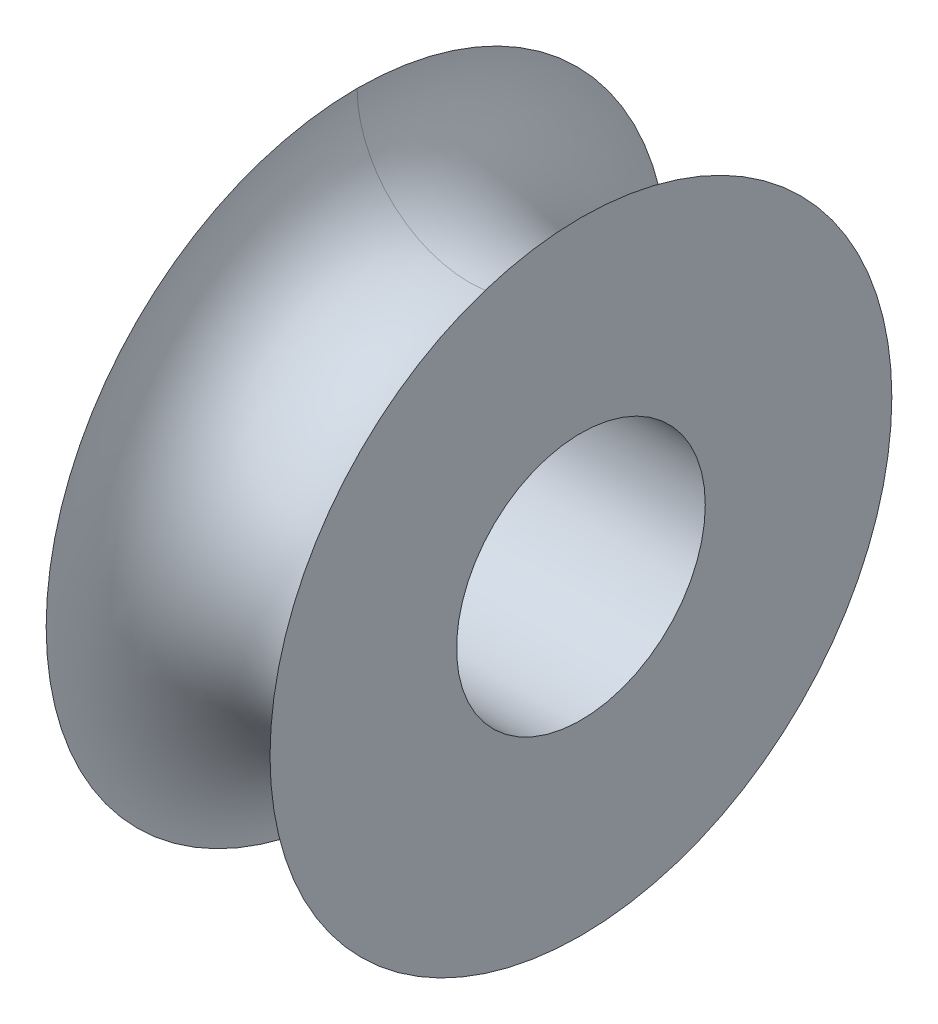
ISO-10303-21;
HEADER;
FILE_DESCRIPTION(('STEP AP214'),'2;1');
FILE_NAME('part.step','',(''),(''),'','','');
FILE_SCHEMA(('AUTOMOTIVE_DESIGN { 1 0 10303 214 1 1 1 1 }'));
ENDSEC;
DATA;
#1=APPLICATION_CONTEXT('core data for automotive mechanical design processes');
#2=APPLICATION_PROTOCOL_DEFINITION('international standard','automotive_design',2000,#1);
#3=PRODUCT_CONTEXT('',#1,'mechanical');
#4=PRODUCT('Part','Part','',(#3));
#5=PRODUCT_RELATED_PRODUCT_CATEGORY('part','',(#4));
#6=PRODUCT_DEFINITION_FORMATION('','',#4);
#7=PRODUCT_DEFINITION_CONTEXT('part definition',#1,'design');
#8=PRODUCT_DEFINITION('design','',#6,#7);
#9=PRODUCT_DEFINITION_SHAPE('','',#8);
#10=(LENGTH_UNIT() NAMED_UNIT(*) SI_UNIT(.MILLI.,.METRE.));
#11=(NAMED_UNIT(*) PLANE_ANGLE_UNIT() SI_UNIT($,.RADIAN.));
#12=(NAMED_UNIT(*) SI_UNIT($,.STERADIAN.) SOLID_ANGLE_UNIT());
#13=UNCERTAINTY_MEASURE_WITH_UNIT(LENGTH_MEASURE(1.E-05),#10,'distance_accuracy_value','');
#14=(GEOMETRIC_REPRESENTATION_CONTEXT(3) GLOBAL_UNCERTAINTY_ASSIGNED_CONTEXT((#13)) GLOBAL_UNIT_ASSIGNED_CONTEXT((#10,
#11,#12)) REPRESENTATION_CONTEXT('',''));
#15=CARTESIAN_POINT('',(0.,0.,0.));
#16=DIRECTION('',(0.,0.,1.));
#17=DIRECTION('',(1.,0.,0.));
#18=AXIS2_PLACEMENT_3D('',#15,#16,#17);
#19=CARTESIAN_POINT('',(1.8,0.,0.));
#20=DIRECTION('',(1.,0.,0.));
#21=DIRECTION('',(0.,0.,-1.));
#22=AXIS2_PLACEMENT_3D('',#19,#20,#21);
#23=PLANE('',#22);
#24=CARTESIAN_POINT('',(1.8,0.,0.));
#25=DIRECTION('',(1.,0.,0.));
#26=DIRECTION('',(0.,0.,-1.));
#27=AXIS2_PLACEMENT_3D('',#24,#25,#26);
#28=CIRCLE('',#27,2.5);
#29=CARTESIAN_POINT('',(1.8,0.,-2.5));
#30=VERTEX_POINT('',#29);
#31=CARTESIAN_POINT('',(1.8,2.5,0.));
#32=VERTEX_POINT('',#31);
#33=EDGE_CURVE('E11',#30,#32,#28,.T.);
#34=ORIENTED_EDGE('',*,*,#33,.T.);
#35=CARTESIAN_POINT('',(1.8,0.,0.));
#36=DIRECTION('',(-1.,0.,0.));
#37=DIRECTION('',(0.,0.,-1.));
#38=AXIS2_PLACEMENT_3D('',#35,#36,#37);
#39=CIRCLE('',#38,2.5);
#40=EDGE_CURVE('E74',#30,#32,#39,.T.);
#41=ORIENTED_EDGE('',*,*,#40,.F.);
#42=EDGE_LOOP('',(#34,#41));
#43=FACE_BOUND('',#42,.T.);
#44=CARTESIAN_POINT('',(1.8,0.,0.));
#45=DIRECTION('',(1.,0.,0.));
#46=DIRECTION('',(0.,0.,-1.));
#47=AXIS2_PLACEMENT_3D('',#44,#45,#46);
#48=CIRCLE('',#47,1.);
#49=CARTESIAN_POINT('',(1.8,0.,-1.));
#50=VERTEX_POINT('',#49);
#51=EDGE_CURVE('E85',#50,#50,#48,.T.);
#52=ORIENTED_EDGE('',*,*,#51,.F.);
#53=EDGE_LOOP('',(#52));
#54=FACE_BOUND('',#53,.T.);
#55=ADVANCED_FACE('F39',(#43,#54),#23,.T.);
#56=CARTESIAN_POINT('',(0.,0.,0.));
#57=DIRECTION('',(1.,0.,0.));
#58=DIRECTION('',(0.,0.,-1.));
#59=AXIS2_PLACEMENT_3D('',#56,#57,#58);
#60=PLANE('',#59);
#61=CARTESIAN_POINT('',(0.,0.,0.));
#62=DIRECTION('',(1.,0.,0.));
#63=DIRECTION('',(0.,0.,-1.));
#64=AXIS2_PLACEMENT_3D('',#61,#62,#63);
#65=CIRCLE('',#64,2.5);
#66=CARTESIAN_POINT('',(0.,0.,-2.5));
#67=VERTEX_POINT('',#66);
#68=CARTESIAN_POINT('',(0.,2.5,0.));
#69=VERTEX_POINT('',#68);
#70=EDGE_CURVE('E49',#67,#69,#65,.T.);
#71=ORIENTED_EDGE('',*,*,#70,.F.);
#72=CARTESIAN_POINT('',(0.,0.,0.));
#73=DIRECTION('',(-1.,0.,0.));
#74=DIRECTION('',(0.,0.,-1.));
#75=AXIS2_PLACEMENT_3D('',#72,#73,#74);
#76=CIRCLE('',#75,2.5);
#77=EDGE_CURVE('E79',#67,#69,#76,.T.);
#78=ORIENTED_EDGE('',*,*,#77,.T.);
#79=EDGE_LOOP('',(#71,#78));
#80=FACE_BOUND('',#79,.T.);
#81=CARTESIAN_POINT('',(0.,0.,0.));
#82=DIRECTION('',(1.,0.,0.));
#83=DIRECTION('',(0.,0.,-1.));
#84=AXIS2_PLACEMENT_3D('',#81,#82,#83);
#85=CIRCLE('',#84,1.);
#86=CARTESIAN_POINT('',(0.,0.,-1.));
#87=VERTEX_POINT('',#86);
#88=EDGE_CURVE('E78',#87,#87,#85,.T.);
#89=ORIENTED_EDGE('',*,*,#88,.T.);
#90=EDGE_LOOP('',(#89));
#91=FACE_BOUND('',#90,.T.);
#92=ADVANCED_FACE('F41',(#80,#91),#60,.F.);
#93=CARTESIAN_POINT('',(1.8,0.,0.));
#94=DIRECTION('',(-1.,0.,0.));
#95=DIRECTION('',(0.,0.,1.));
#96=AXIS2_PLACEMENT_3D('',#93,#94,#95);
#97=CYLINDRICAL_SURFACE('',#96,1.);
#98=ORIENTED_EDGE('',*,*,#51,.T.);
#99=EDGE_LOOP('',(#98));
#100=FACE_BOUND('',#99,.T.);
#101=ORIENTED_EDGE('',*,*,#88,.F.);
#102=EDGE_LOOP('',(#101));
#103=FACE_BOUND('',#102,.T.);
#104=ADVANCED_FACE('F106',(#100,#103),#97,.F.);
#105=CARTESIAN_POINT('',(0.9,0.,0.));
#106=DIRECTION('',(-1.,0.,0.));
#107=DIRECTION('',(0.,0.,1.));
#108=AXIS2_PLACEMENT_3D('',#105,#106,#107);
#109=TOROIDAL_SURFACE('',#108,2.5,0.9);
#110=CARTESIAN_POINT('',(0.9,2.5,0.));
#111=DIRECTION('',(0.,0.,1.));
#112=DIRECTION('',(1.,0.,0.));
#113=AXIS2_PLACEMENT_3D('',#110,#111,#112);
#114=CIRCLE('',#113,0.9);
#115=EDGE_CURVE('E64',#69,#32,#114,.T.);
#116=ORIENTED_EDGE('',*,*,#115,.F.);
#117=ORIENTED_EDGE('',*,*,#77,.F.);
#118=CARTESIAN_POINT('',(0.9,0.,-2.5));
#119=DIRECTION('',(0.,1.,0.));
#120=DIRECTION('',(1.,0.,0.));
#121=AXIS2_PLACEMENT_3D('',#118,#119,#120);
#122=CIRCLE('',#121,0.9);
#123=EDGE_CURVE('E71',#67,#30,#122,.T.);
#124=ORIENTED_EDGE('',*,*,#123,.T.);
#125=ORIENTED_EDGE('',*,*,#40,.T.);
#126=EDGE_LOOP('',(#116,#117,#124,#125));
#127=FACE_BOUND('',#126,.T.);
#128=ADVANCED_FACE('F75',(#127),#109,.F.);
#129=CARTESIAN_POINT('',(0.9,0.,0.));
#130=DIRECTION('',(-1.,0.,0.));
#131=DIRECTION('',(0.,0.,1.));
#132=AXIS2_PLACEMENT_3D('',#129,#130,#131);
#133=TOROIDAL_SURFACE('',#132,2.5,0.9);
#134=ORIENTED_EDGE('',*,*,#33,.F.);
#135=ORIENTED_EDGE('',*,*,#123,.F.);
#136=ORIENTED_EDGE('',*,*,#70,.T.);
#137=ORIENTED_EDGE('',*,*,#115,.T.);
#138=EDGE_LOOP('',(#134,#135,#136,#137));
#139=FACE_BOUND('',#138,.T.);
#140=ADVANCED_FACE('F66',(#139),#133,.F.);
#141=CLOSED_SHELL('',(#55,#92,#104,#128,#140));
#142=MANIFOLD_SOLID_BREP('B2',#141);
#143=ADVANCED_BREP_SHAPE_REPRESENTATION('',(#18,#142),#14);
#144=SHAPE_DEFINITION_REPRESENTATION(#9,#143);
ENDSEC;
END-ISO-10303-21;
